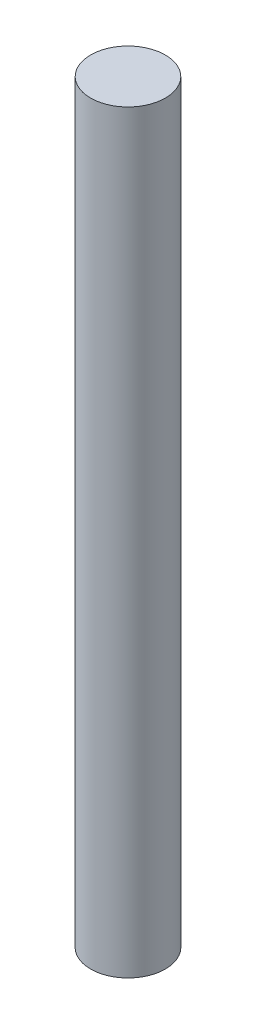
ISO-10303-21;
HEADER;
FILE_DESCRIPTION(('STEP AP214'),'2;1');
FILE_NAME('part.step','',(''),(''),'','','');
FILE_SCHEMA(('AUTOMOTIVE_DESIGN { 1 0 10303 214 1 1 1 1 }'));
ENDSEC;
DATA;
#1=APPLICATION_CONTEXT('core data for automotive mechanical design processes');
#2=APPLICATION_PROTOCOL_DEFINITION('international standard','automotive_design',2000,#1);
#3=PRODUCT_CONTEXT('',#1,'mechanical');
#4=PRODUCT('Part','Part','',(#3));
#5=PRODUCT_RELATED_PRODUCT_CATEGORY('part','',(#4));
#6=PRODUCT_DEFINITION_FORMATION('','',#4);
#7=PRODUCT_DEFINITION_CONTEXT('part definition',#1,'design');
#8=PRODUCT_DEFINITION('design','',#6,#7);
#9=PRODUCT_DEFINITION_SHAPE('','',#8);
#10=(LENGTH_UNIT() NAMED_UNIT(*) SI_UNIT(.MILLI.,.METRE.));
#11=(NAMED_UNIT(*) PLANE_ANGLE_UNIT() SI_UNIT($,.RADIAN.));
#12=(NAMED_UNIT(*) SI_UNIT($,.STERADIAN.) SOLID_ANGLE_UNIT());
#13=UNCERTAINTY_MEASURE_WITH_UNIT(LENGTH_MEASURE(1.E-05),#10,'distance_accuracy_value','');
#14=(GEOMETRIC_REPRESENTATION_CONTEXT(3) GLOBAL_UNCERTAINTY_ASSIGNED_CONTEXT((#13)) GLOBAL_UNIT_ASSIGNED_CONTEXT((#10,
#11,#12)) REPRESENTATION_CONTEXT('',''));
#15=CARTESIAN_POINT('',(0.,0.,0.));
#16=DIRECTION('',(0.,0.,1.));
#17=DIRECTION('',(1.,0.,0.));
#18=AXIS2_PLACEMENT_3D('',#15,#16,#17);
#19=CARTESIAN_POINT('',(0.,100.96,0.));
#20=DIRECTION('',(0.,-1.,0.));
#21=DIRECTION('',(0.,0.,-1.));
#22=AXIS2_PLACEMENT_3D('',#19,#20,#21);
#23=CYLINDRICAL_SURFACE('',#22,5.);
#24=CARTESIAN_POINT('',(0.,100.96,0.));
#25=DIRECTION('',(0.,1.,0.));
#26=DIRECTION('',(0.,0.,1.));
#27=AXIS2_PLACEMENT_3D('',#24,#25,#26);
#28=CIRCLE('',#27,5.);
#29=CARTESIAN_POINT('',(0.,100.96,5.));
#30=VERTEX_POINT('',#29);
#31=EDGE_CURVE('E10',#30,#30,#28,.T.);
#32=ORIENTED_EDGE('',*,*,#31,.F.);
#33=EDGE_LOOP('',(#32));
#34=FACE_BOUND('',#33,.T.);
#35=CARTESIAN_POINT('',(0.,0.,0.));
#36=DIRECTION('',(0.,1.,0.));
#37=DIRECTION('',(0.,0.,1.));
#38=AXIS2_PLACEMENT_3D('',#35,#36,#37);
#39=CIRCLE('',#38,5.);
#40=CARTESIAN_POINT('',(0.,0.,5.));
#41=VERTEX_POINT('',#40);
#42=EDGE_CURVE('E44',#41,#41,#39,.T.);
#43=ORIENTED_EDGE('',*,*,#42,.T.);
#44=EDGE_LOOP('',(#43));
#45=FACE_BOUND('',#44,.T.);
#46=ADVANCED_FACE('F41',(#34,#45),#23,.T.);
#47=CARTESIAN_POINT('',(0.,100.96,0.));
#48=DIRECTION('',(0.,1.,0.));
#49=DIRECTION('',(0.,0.,1.));
#50=AXIS2_PLACEMENT_3D('',#47,#48,#49);
#51=PLANE('',#50);
#52=ORIENTED_EDGE('',*,*,#31,.T.);
#53=EDGE_LOOP('',(#52));
#54=FACE_BOUND('',#53,.T.);
#55=ADVANCED_FACE('F60',(#54),#51,.T.);
#56=CARTESIAN_POINT('',(0.,0.,0.));
#57=DIRECTION('',(0.,1.,0.));
#58=DIRECTION('',(0.,0.,1.));
#59=AXIS2_PLACEMENT_3D('',#56,#57,#58);
#60=PLANE('',#59);
#61=ORIENTED_EDGE('',*,*,#42,.F.);
#62=EDGE_LOOP('',(#61));
#63=FACE_BOUND('',#62,.T.);
#64=ADVANCED_FACE('F58',(#63),#60,.F.);
#65=CLOSED_SHELL('',(#46,#55,#64));
#66=MANIFOLD_SOLID_BREP('B2',#65);
#67=ADVANCED_BREP_SHAPE_REPRESENTATION('',(#18,#66),#14);
#68=SHAPE_DEFINITION_REPRESENTATION(#9,#67);
ENDSEC;
END-ISO-10303-21;
